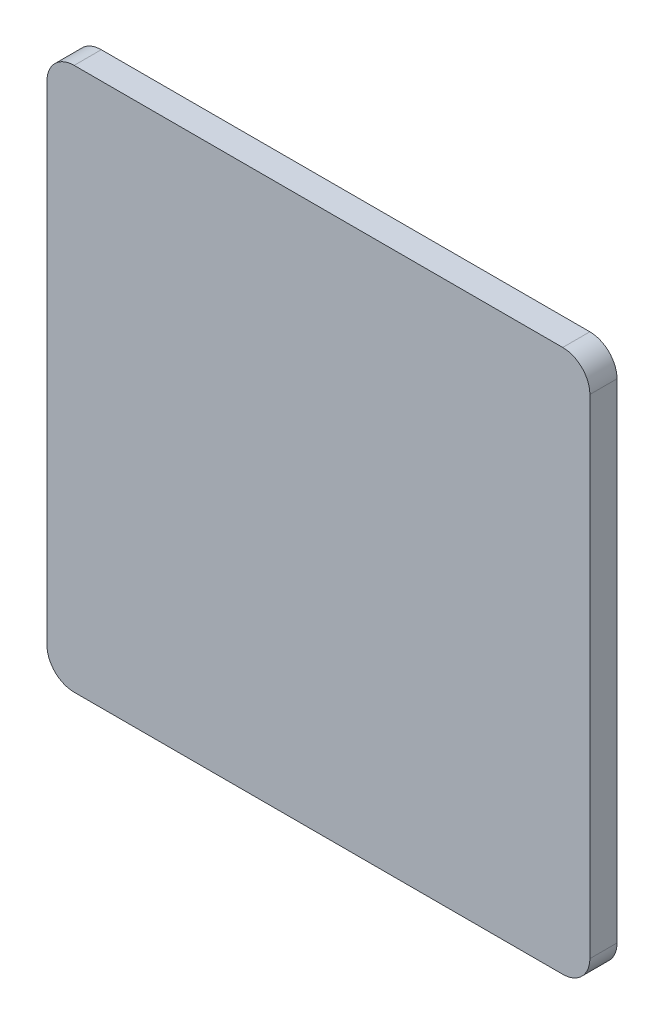
ISO-10303-21;
HEADER;
FILE_DESCRIPTION(('STEP AP214'),'2;1');
FILE_NAME('part.step','',(''),(''),'','','');
FILE_SCHEMA(('AUTOMOTIVE_DESIGN { 1 0 10303 214 1 1 1 1 }'));
ENDSEC;
DATA;
#1=APPLICATION_CONTEXT('core data for automotive mechanical design processes');
#2=APPLICATION_PROTOCOL_DEFINITION('international standard','automotive_design',2000,#1);
#3=PRODUCT_CONTEXT('',#1,'mechanical');
#4=PRODUCT('Part','Part','',(#3));
#5=PRODUCT_RELATED_PRODUCT_CATEGORY('part','',(#4));
#6=PRODUCT_DEFINITION_FORMATION('','',#4);
#7=PRODUCT_DEFINITION_CONTEXT('part definition',#1,'design');
#8=PRODUCT_DEFINITION('design','',#6,#7);
#9=PRODUCT_DEFINITION_SHAPE('','',#8);
#10=(LENGTH_UNIT() NAMED_UNIT(*) SI_UNIT(.MILLI.,.METRE.));
#11=(NAMED_UNIT(*) PLANE_ANGLE_UNIT() SI_UNIT($,.RADIAN.));
#12=(NAMED_UNIT(*) SI_UNIT($,.STERADIAN.) SOLID_ANGLE_UNIT());
#13=UNCERTAINTY_MEASURE_WITH_UNIT(LENGTH_MEASURE(1.E-05),#10,'distance_accuracy_value','');
#14=(GEOMETRIC_REPRESENTATION_CONTEXT(3) GLOBAL_UNCERTAINTY_ASSIGNED_CONTEXT((#13)) GLOBAL_UNIT_ASSIGNED_CONTEXT((#10,
#11,#12)) REPRESENTATION_CONTEXT('',''));
#15=CARTESIAN_POINT('',(0.,0.,0.));
#16=DIRECTION('',(0.,0.,1.));
#17=DIRECTION('',(1.,0.,0.));
#18=AXIS2_PLACEMENT_3D('',#15,#16,#17);
#19=CARTESIAN_POINT('',(0.,0.,1.));
#20=DIRECTION('',(1.,0.,0.));
#21=DIRECTION('',(0.,0.,-1.));
#22=AXIS2_PLACEMENT_3D('',#19,#20,#21);
#23=PLANE('',#22);
#24=DIRECTION('',(0.,-1.,0.));
#25=VECTOR('',#24,1.);
#26=CARTESIAN_POINT('',(0.,0.,0.));
#27=LINE('',#26,#25);
#28=CARTESIAN_POINT('',(0.,19.,0.));
#29=VERTEX_POINT('',#28);
#30=CARTESIAN_POINT('',(0.,1.,0.));
#31=VERTEX_POINT('',#30);
#32=EDGE_CURVE('E126',#29,#31,#27,.T.);
#33=ORIENTED_EDGE('',*,*,#32,.T.);
#34=DIRECTION('',(0.,0.,-1.));
#35=VECTOR('',#34,1.);
#36=CARTESIAN_POINT('',(0.,1.,1.));
#37=LINE('',#36,#35);
#38=CARTESIAN_POINT('',(0.,1.,1.));
#39=VERTEX_POINT('',#38);
#40=EDGE_CURVE('E104',#31,#39,#37,.F.);
#41=ORIENTED_EDGE('',*,*,#40,.T.);
#42=DIRECTION('',(0.,-1.,0.));
#43=VECTOR('',#42,1.);
#44=CARTESIAN_POINT('',(0.,0.,1.));
#45=LINE('',#44,#43);
#46=CARTESIAN_POINT('',(0.,19.,1.));
#47=VERTEX_POINT('',#46);
#48=EDGE_CURVE('E135',#47,#39,#45,.T.);
#49=ORIENTED_EDGE('',*,*,#48,.F.);
#50=DIRECTION('',(0.,0.,-1.));
#51=VECTOR('',#50,1.);
#52=CARTESIAN_POINT('',(0.,19.,1.));
#53=LINE('',#52,#51);
#54=EDGE_CURVE('E109',#47,#29,#53,.T.);
#55=ORIENTED_EDGE('',*,*,#54,.T.);
#56=EDGE_LOOP('',(#33,#41,#49,#55));
#57=FACE_BOUND('',#56,.T.);
#58=ADVANCED_FACE('F33',(#57),#23,.F.);
#59=CARTESIAN_POINT('',(0.,0.,1.));
#60=DIRECTION('',(0.,1.,0.));
#61=DIRECTION('',(0.,0.,1.));
#62=AXIS2_PLACEMENT_3D('',#59,#60,#61);
#63=PLANE('',#62);
#64=DIRECTION('',(1.,0.,0.));
#65=VECTOR('',#64,1.);
#66=CARTESIAN_POINT('',(0.,0.,1.));
#67=LINE('',#66,#65);
#68=CARTESIAN_POINT('',(1.,0.,1.));
#69=VERTEX_POINT('',#68);
#70=CARTESIAN_POINT('',(19.,0.,1.));
#71=VERTEX_POINT('',#70);
#72=EDGE_CURVE('E119',#69,#71,#67,.T.);
#73=ORIENTED_EDGE('',*,*,#72,.F.);
#74=DIRECTION('',(0.,0.,-1.));
#75=VECTOR('',#74,1.);
#76=CARTESIAN_POINT('',(1.,0.,1.));
#77=LINE('',#76,#75);
#78=CARTESIAN_POINT('',(1.,0.,0.));
#79=VERTEX_POINT('',#78);
#80=EDGE_CURVE('E103',#69,#79,#77,.T.);
#81=ORIENTED_EDGE('',*,*,#80,.T.);
#82=DIRECTION('',(1.,0.,0.));
#83=VECTOR('',#82,1.);
#84=CARTESIAN_POINT('',(0.,0.,0.));
#85=LINE('',#84,#83);
#86=CARTESIAN_POINT('',(19.,0.,0.));
#87=VERTEX_POINT('',#86);
#88=EDGE_CURVE('E116',#79,#87,#85,.T.);
#89=ORIENTED_EDGE('',*,*,#88,.T.);
#90=DIRECTION('',(0.,0.,-1.));
#91=VECTOR('',#90,1.);
#92=CARTESIAN_POINT('',(19.,0.,1.));
#93=LINE('',#92,#91);
#94=EDGE_CURVE('E121',#87,#71,#93,.F.);
#95=ORIENTED_EDGE('',*,*,#94,.T.);
#96=EDGE_LOOP('',(#73,#81,#89,#95));
#97=FACE_BOUND('',#96,.T.);
#98=ADVANCED_FACE('F115',(#97),#63,.F.);
#99=CARTESIAN_POINT('',(20.,0.,1.));
#100=DIRECTION('',(-1.,0.,0.));
#101=DIRECTION('',(0.,0.,1.));
#102=AXIS2_PLACEMENT_3D('',#99,#100,#101);
#103=PLANE('',#102);
#104=DIRECTION('',(0.,1.,0.));
#105=VECTOR('',#104,1.);
#106=CARTESIAN_POINT('',(20.,0.,1.));
#107=LINE('',#106,#105);
#108=CARTESIAN_POINT('',(20.,1.,1.));
#109=VERTEX_POINT('',#108);
#110=CARTESIAN_POINT('',(20.,19.,1.));
#111=VERTEX_POINT('',#110);
#112=EDGE_CURVE('E161',#109,#111,#107,.T.);
#113=ORIENTED_EDGE('',*,*,#112,.F.);
#114=DIRECTION('',(0.,0.,-1.));
#115=VECTOR('',#114,1.);
#116=CARTESIAN_POINT('',(20.,1.,1.));
#117=LINE('',#116,#115);
#118=CARTESIAN_POINT('',(20.,1.,0.));
#119=VERTEX_POINT('',#118);
#120=EDGE_CURVE('E154',#109,#119,#117,.T.);
#121=ORIENTED_EDGE('',*,*,#120,.T.);
#122=DIRECTION('',(0.,1.,0.));
#123=VECTOR('',#122,1.);
#124=CARTESIAN_POINT('',(20.,0.,0.));
#125=LINE('',#124,#123);
#126=CARTESIAN_POINT('',(20.,19.,0.));
#127=VERTEX_POINT('',#126);
#128=EDGE_CURVE('E125',#119,#127,#125,.T.);
#129=ORIENTED_EDGE('',*,*,#128,.T.);
#130=DIRECTION('',(0.,0.,-1.));
#131=VECTOR('',#130,1.);
#132=CARTESIAN_POINT('',(20.,19.,1.));
#133=LINE('',#132,#131);
#134=EDGE_CURVE('E152',#127,#111,#133,.F.);
#135=ORIENTED_EDGE('',*,*,#134,.T.);
#136=EDGE_LOOP('',(#113,#121,#129,#135));
#137=FACE_BOUND('',#136,.T.);
#138=ADVANCED_FACE('F159',(#137),#103,.F.);
#139=CARTESIAN_POINT('',(0.,20.,1.));
#140=DIRECTION('',(0.,-1.,0.));
#141=DIRECTION('',(0.,0.,-1.));
#142=AXIS2_PLACEMENT_3D('',#139,#140,#141);
#143=PLANE('',#142);
#144=DIRECTION('',(-1.,0.,0.));
#145=VECTOR('',#144,1.);
#146=CARTESIAN_POINT('',(0.,20.,1.));
#147=LINE('',#146,#145);
#148=CARTESIAN_POINT('',(19.,20.,1.));
#149=VERTEX_POINT('',#148);
#150=CARTESIAN_POINT('',(1.,20.,1.));
#151=VERTEX_POINT('',#150);
#152=EDGE_CURVE('E136',#149,#151,#147,.T.);
#153=ORIENTED_EDGE('',*,*,#152,.F.);
#154=DIRECTION('',(0.,0.,-1.));
#155=VECTOR('',#154,1.);
#156=CARTESIAN_POINT('',(19.,20.,1.));
#157=LINE('',#156,#155);
#158=CARTESIAN_POINT('',(19.,20.,0.));
#159=VERTEX_POINT('',#158);
#160=EDGE_CURVE('E11',#149,#159,#157,.T.);
#161=ORIENTED_EDGE('',*,*,#160,.T.);
#162=DIRECTION('',(-1.,0.,0.));
#163=VECTOR('',#162,1.);
#164=CARTESIAN_POINT('',(0.,20.,0.));
#165=LINE('',#164,#163);
#166=CARTESIAN_POINT('',(1.,20.,0.));
#167=VERTEX_POINT('',#166);
#168=EDGE_CURVE('E129',#159,#167,#165,.T.);
#169=ORIENTED_EDGE('',*,*,#168,.T.);
#170=DIRECTION('',(0.,0.,-1.));
#171=VECTOR('',#170,1.);
#172=CARTESIAN_POINT('',(1.,20.,1.));
#173=LINE('',#172,#171);
#174=EDGE_CURVE('E41',#167,#151,#173,.F.);
#175=ORIENTED_EDGE('',*,*,#174,.T.);
#176=EDGE_LOOP('',(#153,#161,#169,#175));
#177=FACE_BOUND('',#176,.T.);
#178=ADVANCED_FACE('F168',(#177),#143,.F.);
#179=CARTESIAN_POINT('',(0.,0.,1.));
#180=DIRECTION('',(0.,0.,-1.));
#181=DIRECTION('',(-1.,0.,0.));
#182=AXIS2_PLACEMENT_3D('',#179,#180,#181);
#183=PLANE('',#182);
#184=ORIENTED_EDGE('',*,*,#48,.T.);
#185=CARTESIAN_POINT('',(1.,1.,1.));
#186=DIRECTION('',(0.,0.,-1.));
#187=DIRECTION('',(-1.,0.,0.));
#188=AXIS2_PLACEMENT_3D('',#185,#186,#187);
#189=CIRCLE('',#188,1.);
#190=EDGE_CURVE('E150',#39,#69,#189,.F.);
#191=ORIENTED_EDGE('',*,*,#190,.T.);
#192=ORIENTED_EDGE('',*,*,#72,.T.);
#193=CARTESIAN_POINT('',(19.,1.,1.));
#194=DIRECTION('',(0.,0.,-1.));
#195=DIRECTION('',(-1.,0.,0.));
#196=AXIS2_PLACEMENT_3D('',#193,#194,#195);
#197=CIRCLE('',#196,1.);
#198=EDGE_CURVE('E148',#71,#109,#197,.F.);
#199=ORIENTED_EDGE('',*,*,#198,.T.);
#200=ORIENTED_EDGE('',*,*,#112,.T.);
#201=CARTESIAN_POINT('',(19.,19.,1.));
#202=DIRECTION('',(0.,0.,-1.));
#203=DIRECTION('',(-1.,0.,0.));
#204=AXIS2_PLACEMENT_3D('',#201,#202,#203);
#205=CIRCLE('',#204,1.);
#206=EDGE_CURVE('E54',#111,#149,#205,.F.);
#207=ORIENTED_EDGE('',*,*,#206,.T.);
#208=ORIENTED_EDGE('',*,*,#152,.T.);
#209=CARTESIAN_POINT('',(1.,19.,1.));
#210=DIRECTION('',(0.,0.,-1.));
#211=DIRECTION('',(-1.,0.,0.));
#212=AXIS2_PLACEMENT_3D('',#209,#210,#211);
#213=CIRCLE('',#212,1.);
#214=EDGE_CURVE('E145',#151,#47,#213,.F.);
#215=ORIENTED_EDGE('',*,*,#214,.T.);
#216=EDGE_LOOP('',(#184,#191,#192,#199,#200,#207,#208,#215));
#217=FACE_BOUND('',#216,.T.);
#218=ADVANCED_FACE('F175',(#217),#183,.F.);
#219=CARTESIAN_POINT('',(0.,0.,0.));
#220=DIRECTION('',(0.,0.,-1.));
#221=DIRECTION('',(-1.,0.,0.));
#222=AXIS2_PLACEMENT_3D('',#219,#220,#221);
#223=PLANE('',#222);
#224=ORIENTED_EDGE('',*,*,#88,.F.);
#225=CARTESIAN_POINT('',(1.,1.,0.));
#226=DIRECTION('',(0.,0.,-1.));
#227=DIRECTION('',(-1.,0.,0.));
#228=AXIS2_PLACEMENT_3D('',#225,#226,#227);
#229=CIRCLE('',#228,1.);
#230=EDGE_CURVE('E99',#79,#31,#229,.T.);
#231=ORIENTED_EDGE('',*,*,#230,.T.);
#232=ORIENTED_EDGE('',*,*,#32,.F.);
#233=CARTESIAN_POINT('',(1.,19.,0.));
#234=DIRECTION('',(0.,0.,-1.));
#235=DIRECTION('',(-1.,0.,0.));
#236=AXIS2_PLACEMENT_3D('',#233,#234,#235);
#237=CIRCLE('',#236,1.);
#238=EDGE_CURVE('E120',#29,#167,#237,.T.);
#239=ORIENTED_EDGE('',*,*,#238,.T.);
#240=ORIENTED_EDGE('',*,*,#168,.F.);
#241=CARTESIAN_POINT('',(19.,19.,0.));
#242=DIRECTION('',(0.,0.,-1.));
#243=DIRECTION('',(-1.,0.,0.));
#244=AXIS2_PLACEMENT_3D('',#241,#242,#243);
#245=CIRCLE('',#244,1.);
#246=EDGE_CURVE('E139',#159,#127,#245,.T.);
#247=ORIENTED_EDGE('',*,*,#246,.T.);
#248=ORIENTED_EDGE('',*,*,#128,.F.);
#249=CARTESIAN_POINT('',(19.,1.,0.));
#250=DIRECTION('',(0.,0.,-1.));
#251=DIRECTION('',(-1.,0.,0.));
#252=AXIS2_PLACEMENT_3D('',#249,#250,#251);
#253=CIRCLE('',#252,1.);
#254=EDGE_CURVE('E110',#119,#87,#253,.T.);
#255=ORIENTED_EDGE('',*,*,#254,.T.);
#256=EDGE_LOOP('',(#224,#231,#232,#239,#240,#247,#248,#255));
#257=FACE_BOUND('',#256,.T.);
#258=ADVANCED_FACE('F123',(#257),#223,.T.);
#259=CARTESIAN_POINT('',(1.,1.,1.));
#260=DIRECTION('',(0.,0.,-1.));
#261=DIRECTION('',(-1.,0.,0.));
#262=AXIS2_PLACEMENT_3D('',#259,#260,#261);
#263=CYLINDRICAL_SURFACE('',#262,1.);
#264=ORIENTED_EDGE('',*,*,#190,.F.);
#265=ORIENTED_EDGE('',*,*,#40,.F.);
#266=ORIENTED_EDGE('',*,*,#230,.F.);
#267=ORIENTED_EDGE('',*,*,#80,.F.);
#268=EDGE_LOOP('',(#264,#265,#266,#267));
#269=FACE_BOUND('',#268,.T.);
#270=ADVANCED_FACE('F102',(#269),#263,.T.);
#271=CARTESIAN_POINT('',(19.,1.,1.));
#272=DIRECTION('',(0.,0.,-1.));
#273=DIRECTION('',(-1.,0.,0.));
#274=AXIS2_PLACEMENT_3D('',#271,#272,#273);
#275=CYLINDRICAL_SURFACE('',#274,1.);
#276=ORIENTED_EDGE('',*,*,#198,.F.);
#277=ORIENTED_EDGE('',*,*,#94,.F.);
#278=ORIENTED_EDGE('',*,*,#254,.F.);
#279=ORIENTED_EDGE('',*,*,#120,.F.);
#280=EDGE_LOOP('',(#276,#277,#278,#279));
#281=FACE_BOUND('',#280,.T.);
#282=ADVANCED_FACE('F183',(#281),#275,.T.);
#283=CARTESIAN_POINT('',(19.,19.,1.));
#284=DIRECTION('',(0.,0.,-1.));
#285=DIRECTION('',(-1.,0.,0.));
#286=AXIS2_PLACEMENT_3D('',#283,#284,#285);
#287=CYLINDRICAL_SURFACE('',#286,1.);
#288=ORIENTED_EDGE('',*,*,#206,.F.);
#289=ORIENTED_EDGE('',*,*,#134,.F.);
#290=ORIENTED_EDGE('',*,*,#246,.F.);
#291=ORIENTED_EDGE('',*,*,#160,.F.);
#292=EDGE_LOOP('',(#288,#289,#290,#291));
#293=FACE_BOUND('',#292,.T.);
#294=ADVANCED_FACE('F167',(#293),#287,.T.);
#295=CARTESIAN_POINT('',(1.,19.,1.));
#296=DIRECTION('',(0.,0.,-1.));
#297=DIRECTION('',(-1.,0.,0.));
#298=AXIS2_PLACEMENT_3D('',#295,#296,#297);
#299=CYLINDRICAL_SURFACE('',#298,1.);
#300=ORIENTED_EDGE('',*,*,#214,.F.);
#301=ORIENTED_EDGE('',*,*,#174,.F.);
#302=ORIENTED_EDGE('',*,*,#238,.F.);
#303=ORIENTED_EDGE('',*,*,#54,.F.);
#304=EDGE_LOOP('',(#300,#301,#302,#303));
#305=FACE_BOUND('',#304,.T.);
#306=ADVANCED_FACE('F35',(#305),#299,.T.);
#307=CLOSED_SHELL('',(#58,#98,#138,#178,#218,#258,#270,#282,#294,#306));
#308=MANIFOLD_SOLID_BREP('B2',#307);
#309=ADVANCED_BREP_SHAPE_REPRESENTATION('',(#18,#308),#14);
#310=SHAPE_DEFINITION_REPRESENTATION(#9,#309);
ENDSEC;
END-ISO-10303-21;
